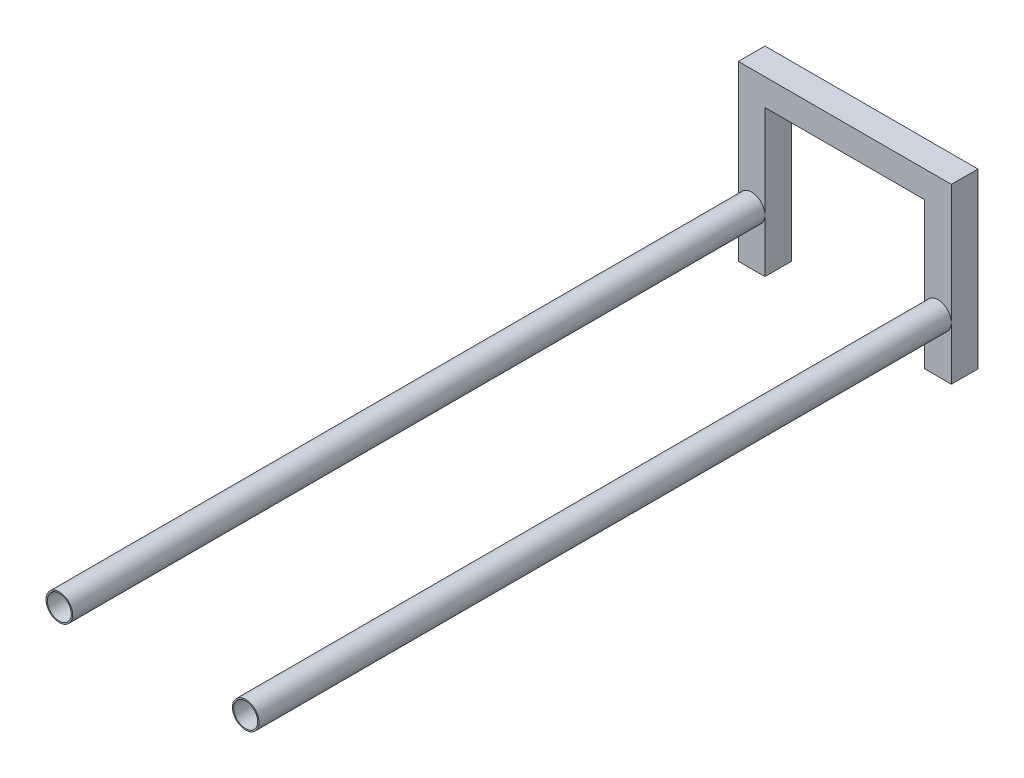
ISO-10303-21;
HEADER;
FILE_DESCRIPTION(('STEP AP214'),'2;1');
FILE_NAME('part.step','',(''),(''),'','','');
FILE_SCHEMA(('AUTOMOTIVE_DESIGN { 1 0 10303 214 1 1 1 1 }'));
ENDSEC;
DATA;
#1=APPLICATION_CONTEXT('core data for automotive mechanical design processes');
#2=APPLICATION_PROTOCOL_DEFINITION('international standard','automotive_design',2000,#1);
#3=PRODUCT_CONTEXT('',#1,'mechanical');
#4=PRODUCT('Part','Part','',(#3));
#5=PRODUCT_RELATED_PRODUCT_CATEGORY('part','',(#4));
#6=PRODUCT_DEFINITION_FORMATION('','',#4);
#7=PRODUCT_DEFINITION_CONTEXT('part definition',#1,'design');
#8=PRODUCT_DEFINITION('design','',#6,#7);
#9=PRODUCT_DEFINITION_SHAPE('','',#8);
#10=(LENGTH_UNIT() NAMED_UNIT(*) SI_UNIT(.MILLI.,.METRE.));
#11=(NAMED_UNIT(*) PLANE_ANGLE_UNIT() SI_UNIT($,.RADIAN.));
#12=(NAMED_UNIT(*) SI_UNIT($,.STERADIAN.) SOLID_ANGLE_UNIT());
#13=UNCERTAINTY_MEASURE_WITH_UNIT(LENGTH_MEASURE(1.E-05),#10,'distance_accuracy_value','');
#14=(GEOMETRIC_REPRESENTATION_CONTEXT(3) GLOBAL_UNCERTAINTY_ASSIGNED_CONTEXT((#13)) GLOBAL_UNIT_ASSIGNED_CONTEXT((#10,
#11,#12)) REPRESENTATION_CONTEXT('',''));
#15=CARTESIAN_POINT('',(0.,0.,0.));
#16=DIRECTION('',(0.,0.,1.));
#17=DIRECTION('',(1.,0.,0.));
#18=AXIS2_PLACEMENT_3D('',#15,#16,#17);
#19=CARTESIAN_POINT('',(101.6,-50.7999999999994,-25.4));
#20=DIRECTION('',(0.,1.,0.));
#21=DIRECTION('',(-1.,0.,0.));
#22=AXIS2_PLACEMENT_3D('',#19,#20,#21);
#23=PLANE('',#22);
#24=DIRECTION('',(-1.,0.,0.));
#25=VECTOR('',#24,1.);
#26=CARTESIAN_POINT('',(101.6,-50.7999999999994,0.));
#27=LINE('',#26,#25);
#28=CARTESIAN_POINT('',(101.6,-50.7999999999994,0.));
#29=VERTEX_POINT('',#28);
#30=CARTESIAN_POINT('',(76.2,-50.7999999999994,0.));
#31=VERTEX_POINT('',#30);
#32=EDGE_CURVE('E264',#29,#31,#27,.T.);
#33=ORIENTED_EDGE('',*,*,#32,.T.);
#34=DIRECTION('',(0.,0.,1.));
#35=VECTOR('',#34,1.);
#36=CARTESIAN_POINT('',(76.2,-50.7999999999994,-25.4));
#37=LINE('',#36,#35);
#38=CARTESIAN_POINT('',(76.2,-50.7999999999994,-25.4));
#39=VERTEX_POINT('',#38);
#40=EDGE_CURVE('E290',#39,#31,#37,.T.);
#41=ORIENTED_EDGE('',*,*,#40,.F.);
#42=DIRECTION('',(-1.,0.,0.));
#43=VECTOR('',#42,1.);
#44=CARTESIAN_POINT('',(101.6,-50.7999999999994,-25.4));
#45=LINE('',#44,#43);
#46=CARTESIAN_POINT('',(101.6,-50.7999999999994,-25.4));
#47=VERTEX_POINT('',#46);
#48=EDGE_CURVE('E243',#47,#39,#45,.T.);
#49=ORIENTED_EDGE('',*,*,#48,.F.);
#50=DIRECTION('',(0.,0.,1.));
#51=VECTOR('',#50,1.);
#52=CARTESIAN_POINT('',(101.6,-50.7999999999994,-25.4));
#53=LINE('',#52,#51);
#54=EDGE_CURVE('E293',#47,#29,#53,.T.);
#55=ORIENTED_EDGE('',*,*,#54,.T.);
#56=EDGE_LOOP('',(#33,#41,#49,#55));
#57=FACE_BOUND('',#56,.T.);
#58=DIRECTION('',(-1.,0.,0.));
#59=VECTOR('',#58,1.);
#60=CARTESIAN_POINT('',(0.,-50.7999999999994,-1.2446));
#61=LINE('',#60,#59);
#62=CARTESIAN_POINT('',(100.3554,-50.7999999999994,-1.2446));
#63=VERTEX_POINT('',#62);
#64=CARTESIAN_POINT('',(77.4446,-50.7999999999994,-1.2446));
#65=VERTEX_POINT('',#64);
#66=EDGE_CURVE('E169',#63,#65,#61,.T.);
#67=ORIENTED_EDGE('',*,*,#66,.F.);
#68=DIRECTION('',(0.,0.,1.));
#69=VECTOR('',#68,1.);
#70=CARTESIAN_POINT('',(100.3554,-50.7999999999994,-25.4));
#71=LINE('',#70,#69);
#72=CARTESIAN_POINT('',(100.3554,-50.7999999999994,-24.1554));
#73=VERTEX_POINT('',#72);
#74=EDGE_CURVE('E203',#73,#63,#71,.T.);
#75=ORIENTED_EDGE('',*,*,#74,.F.);
#76=DIRECTION('',(-1.,0.,0.));
#77=VECTOR('',#76,1.);
#78=CARTESIAN_POINT('',(0.,-50.7999999999994,-24.1554));
#79=LINE('',#78,#77);
#80=CARTESIAN_POINT('',(77.4446,-50.7999999999994,-24.1554));
#81=VERTEX_POINT('',#80);
#82=EDGE_CURVE('E48',#73,#81,#79,.T.);
#83=ORIENTED_EDGE('',*,*,#82,.T.);
#84=DIRECTION('',(0.,0.,1.));
#85=VECTOR('',#84,1.);
#86=CARTESIAN_POINT('',(77.4446,-50.7999999999994,-25.4));
#87=LINE('',#86,#85);
#88=EDGE_CURVE('E179',#81,#65,#87,.T.);
#89=ORIENTED_EDGE('',*,*,#88,.T.);
#90=EDGE_LOOP('',(#67,#75,#83,#89));
#91=FACE_BOUND('',#90,.T.);
#92=ADVANCED_FACE('F33',(#57,#91),#23,.F.);
#93=CARTESIAN_POINT('',(-101.6,-50.7999999999994,-25.4));
#94=DIRECTION('',(0.,1.,0.));
#95=DIRECTION('',(-1.,0.,0.));
#96=AXIS2_PLACEMENT_3D('',#93,#94,#95);
#97=PLANE('',#96);
#98=DIRECTION('',(-1.,0.,0.));
#99=VECTOR('',#98,1.);
#100=CARTESIAN_POINT('',(-101.6,-50.7999999999994,0.));
#101=LINE('',#100,#99);
#102=CARTESIAN_POINT('',(-76.2,-50.7999999999994,0.));
#103=VERTEX_POINT('',#102);
#104=CARTESIAN_POINT('',(-101.6,-50.7999999999994,0.));
#105=VERTEX_POINT('',#104);
#106=EDGE_CURVE('E239',#103,#105,#101,.T.);
#107=ORIENTED_EDGE('',*,*,#106,.T.);
#108=DIRECTION('',(0.,0.,1.));
#109=VECTOR('',#108,1.);
#110=CARTESIAN_POINT('',(-101.6,-50.7999999999994,-25.4));
#111=LINE('',#110,#109);
#112=CARTESIAN_POINT('',(-101.6,-50.7999999999994,-25.4));
#113=VERTEX_POINT('',#112);
#114=EDGE_CURVE('E253',#113,#105,#111,.T.);
#115=ORIENTED_EDGE('',*,*,#114,.F.);
#116=DIRECTION('',(-1.,0.,0.));
#117=VECTOR('',#116,1.);
#118=CARTESIAN_POINT('',(-101.6,-50.7999999999994,-25.4));
#119=LINE('',#118,#117);
#120=CARTESIAN_POINT('',(-76.2,-50.7999999999994,-25.4));
#121=VERTEX_POINT('',#120);
#122=EDGE_CURVE('E251',#121,#113,#119,.T.);
#123=ORIENTED_EDGE('',*,*,#122,.F.);
#124=DIRECTION('',(0.,0.,1.));
#125=VECTOR('',#124,1.);
#126=CARTESIAN_POINT('',(-76.2,-50.7999999999994,-25.4));
#127=LINE('',#126,#125);
#128=EDGE_CURVE('E281',#121,#103,#127,.T.);
#129=ORIENTED_EDGE('',*,*,#128,.T.);
#130=EDGE_LOOP('',(#107,#115,#123,#129));
#131=FACE_BOUND('',#130,.T.);
#132=DIRECTION('',(-1.,0.,0.));
#133=VECTOR('',#132,1.);
#134=CARTESIAN_POINT('',(0.,-50.7999999999994,-1.2446));
#135=LINE('',#134,#133);
#136=CARTESIAN_POINT('',(-77.4446,-50.7999999999994,-1.2446));
#137=VERTEX_POINT('',#136);
#138=CARTESIAN_POINT('',(-100.3554,-50.7999999999994,-1.2446));
#139=VERTEX_POINT('',#138);
#140=EDGE_CURVE('E186',#137,#139,#135,.T.);
#141=ORIENTED_EDGE('',*,*,#140,.F.);
#142=DIRECTION('',(0.,0.,1.));
#143=VECTOR('',#142,1.);
#144=CARTESIAN_POINT('',(-77.4446,-50.7999999999994,-25.4));
#145=LINE('',#144,#143);
#146=CARTESIAN_POINT('',(-77.4446,-50.7999999999994,-24.1554));
#147=VERTEX_POINT('',#146);
#148=EDGE_CURVE('E213',#147,#137,#145,.T.);
#149=ORIENTED_EDGE('',*,*,#148,.F.);
#150=DIRECTION('',(-1.,0.,0.));
#151=VECTOR('',#150,1.);
#152=CARTESIAN_POINT('',(0.,-50.7999999999994,-24.1554));
#153=LINE('',#152,#151);
#154=CARTESIAN_POINT('',(-100.3554,-50.7999999999994,-24.1554));
#155=VERTEX_POINT('',#154);
#156=EDGE_CURVE('E55',#147,#155,#153,.T.);
#157=ORIENTED_EDGE('',*,*,#156,.T.);
#158=DIRECTION('',(0.,0.,1.));
#159=VECTOR('',#158,1.);
#160=CARTESIAN_POINT('',(-100.3554,-50.7999999999994,-25.4));
#161=LINE('',#160,#159);
#162=EDGE_CURVE('E221',#155,#139,#161,.T.);
#163=ORIENTED_EDGE('',*,*,#162,.T.);
#164=EDGE_LOOP('',(#141,#149,#157,#163));
#165=FACE_BOUND('',#164,.T.);
#166=ADVANCED_FACE('F331',(#131,#165),#97,.F.);
#167=CARTESIAN_POINT('',(0.,0.,0.));
#168=DIRECTION('',(0.,0.,1.));
#169=DIRECTION('',(1.,0.,0.));
#170=AXIS2_PLACEMENT_3D('',#167,#168,#169);
#171=PLANE('',#170);
#172=DIRECTION('',(0.,-1.,0.));
#173=VECTOR('',#172,1.);
#174=CARTESIAN_POINT('',(101.6,6.24500451351651E-13,0.));
#175=LINE('',#174,#173);
#176=CARTESIAN_POINT('',(101.6,6.13771459904821E-13,0.));
#177=VERTEX_POINT('',#176);
#178=EDGE_CURVE('E260',#177,#29,#175,.T.);
#179=ORIENTED_EDGE('',*,*,#178,.F.);
#180=CARTESIAN_POINT('',(88.9,6.20710353808728E-13,0.));
#181=DIRECTION('',(0.,0.,1.));
#182=DIRECTION('',(-1.,0.,0.));
#183=AXIS2_PLACEMENT_3D('',#180,#181,#182);
#184=CIRCLE('',#183,12.7);
#185=CARTESIAN_POINT('',(76.2,6.20710353808728E-13,0.));
#186=VERTEX_POINT('',#185);
#187=EDGE_CURVE('E234',#186,#177,#184,.T.);
#188=ORIENTED_EDGE('',*,*,#187,.F.);
#189=DIRECTION('',(0.,1.,0.));
#190=VECTOR('',#189,1.);
#191=CARTESIAN_POINT('',(76.2,88.9,0.));
#192=LINE('',#191,#190);
#193=EDGE_CURVE('E268',#31,#186,#192,.T.);
#194=ORIENTED_EDGE('',*,*,#193,.F.);
#195=ORIENTED_EDGE('',*,*,#32,.F.);
#196=EDGE_LOOP('',(#179,#188,#194,#195));
#197=FACE_BOUND('',#196,.T.);
#198=ADVANCED_FACE('F352',(#197),#171,.T.);
#199=CARTESIAN_POINT('',(76.2,88.9,0.));
#200=VERTEX_POINT('',#199);
#201=EDGE_CURVE('E267',#186,#200,#192,.T.);
#202=ORIENTED_EDGE('',*,*,#201,.F.);
#203=EDGE_CURVE('E229',#177,#186,#184,.T.);
#204=ORIENTED_EDGE('',*,*,#203,.F.);
#205=CARTESIAN_POINT('',(101.6,114.3,0.));
#206=VERTEX_POINT('',#205);
#207=EDGE_CURVE('E261',#206,#177,#175,.T.);
#208=ORIENTED_EDGE('',*,*,#207,.F.);
#209=DIRECTION('',(1.,0.,0.));
#210=VECTOR('',#209,1.);
#211=CARTESIAN_POINT('',(-101.6,114.3,0.));
#212=LINE('',#211,#210);
#213=CARTESIAN_POINT('',(-101.6,114.3,0.));
#214=VERTEX_POINT('',#213);
#215=EDGE_CURVE('E257',#214,#206,#212,.T.);
#216=ORIENTED_EDGE('',*,*,#215,.F.);
#217=DIRECTION('',(0.,1.,0.));
#218=VECTOR('',#217,1.);
#219=CARTESIAN_POINT('',(-101.6,0.,0.));
#220=LINE('',#219,#218);
#221=CARTESIAN_POINT('',(-101.6,0.,0.));
#222=VERTEX_POINT('',#221);
#223=EDGE_CURVE('E233',#222,#214,#220,.T.);
#224=ORIENTED_EDGE('',*,*,#223,.F.);
#225=CARTESIAN_POINT('',(-88.9,0.,0.));
#226=DIRECTION('',(0.,0.,1.));
#227=DIRECTION('',(1.,0.,0.));
#228=AXIS2_PLACEMENT_3D('',#225,#226,#227);
#229=CIRCLE('',#228,12.7);
#230=CARTESIAN_POINT('',(-76.2,0.,0.));
#231=VERTEX_POINT('',#230);
#232=EDGE_CURVE('E310',#231,#222,#229,.T.);
#233=ORIENTED_EDGE('',*,*,#232,.F.);
#234=DIRECTION('',(0.,-1.,0.));
#235=VECTOR('',#234,1.);
#236=CARTESIAN_POINT('',(-76.2,-50.7999999999994,0.));
#237=LINE('',#236,#235);
#238=CARTESIAN_POINT('',(-76.2,88.9,0.));
#239=VERTEX_POINT('',#238);
#240=EDGE_CURVE('E275',#239,#231,#237,.T.);
#241=ORIENTED_EDGE('',*,*,#240,.F.);
#242=DIRECTION('',(-1.,0.,0.));
#243=VECTOR('',#242,1.);
#244=CARTESIAN_POINT('',(-76.2,88.9,0.));
#245=LINE('',#244,#243);
#246=EDGE_CURVE('E271',#200,#239,#245,.T.);
#247=ORIENTED_EDGE('',*,*,#246,.F.);
#248=EDGE_LOOP('',(#202,#204,#208,#216,#224,#233,#241,#247));
#249=FACE_BOUND('',#248,.T.);
#250=ADVANCED_FACE('F323',(#249),#171,.T.);
#251=CARTESIAN_POINT('',(-88.9,0.,660.4));
#252=DIRECTION('',(0.,0.,1.));
#253=DIRECTION('',(1.,0.,0.));
#254=AXIS2_PLACEMENT_3D('',#251,#252,#253);
#255=PLANE('',#254);
#256=CARTESIAN_POINT('',(-88.9,0.,660.4));
#257=DIRECTION('',(0.,0.,1.));
#258=DIRECTION('',(1.,0.,0.));
#259=AXIS2_PLACEMENT_3D('',#256,#257,#258);
#260=CIRCLE('',#259,12.7);
#261=CARTESIAN_POINT('',(-76.2,0.,660.4));
#262=VERTEX_POINT('',#261);
#263=EDGE_CURVE('E41',#262,#262,#260,.T.);
#264=ORIENTED_EDGE('',*,*,#263,.T.);
#265=EDGE_LOOP('',(#264));
#266=FACE_BOUND('',#265,.T.);
#267=CARTESIAN_POINT('',(-88.9,0.,660.4));
#268=DIRECTION('',(0.,0.,1.));
#269=DIRECTION('',(1.,0.,0.));
#270=AXIS2_PLACEMENT_3D('',#267,#268,#269);
#271=CIRCLE('',#270,11.4554);
#272=CARTESIAN_POINT('',(-77.4446,0.,660.4));
#273=VERTEX_POINT('',#272);
#274=EDGE_CURVE('E303',#273,#273,#271,.T.);
#275=ORIENTED_EDGE('',*,*,#274,.F.);
#276=EDGE_LOOP('',(#275));
#277=FACE_BOUND('',#276,.T.);
#278=ADVANCED_FACE('F439',(#266,#277),#255,.T.);
#279=CARTESIAN_POINT('',(-88.9,0.,660.4));
#280=DIRECTION('',(0.,0.,-1.));
#281=DIRECTION('',(-1.,0.,0.));
#282=AXIS2_PLACEMENT_3D('',#279,#280,#281);
#283=CYLINDRICAL_SURFACE('',#282,12.7);
#284=ORIENTED_EDGE('',*,*,#263,.F.);
#285=EDGE_LOOP('',(#284));
#286=FACE_BOUND('',#285,.T.);
#287=ORIENTED_EDGE('',*,*,#232,.T.);
#288=EDGE_CURVE('E306',#222,#231,#229,.T.);
#289=ORIENTED_EDGE('',*,*,#288,.T.);
#290=EDGE_LOOP('',(#287,#289));
#291=FACE_BOUND('',#290,.T.);
#292=ADVANCED_FACE('F35',(#286,#291),#283,.T.);
#293=CARTESIAN_POINT('',(-88.9,0.,660.4));
#294=DIRECTION('',(0.,0.,-1.));
#295=DIRECTION('',(-1.,0.,0.));
#296=AXIS2_PLACEMENT_3D('',#293,#294,#295);
#297=CYLINDRICAL_SURFACE('',#296,11.4554);
#298=ORIENTED_EDGE('',*,*,#274,.T.);
#299=EDGE_LOOP('',(#298));
#300=FACE_BOUND('',#299,.T.);
#301=CARTESIAN_POINT('',(-88.9,0.,0.));
#302=DIRECTION('',(0.,0.,1.));
#303=DIRECTION('',(1.,0.,0.));
#304=AXIS2_PLACEMENT_3D('',#301,#302,#303);
#305=CIRCLE('',#304,11.4554);
#306=CARTESIAN_POINT('',(-77.4446,0.,0.));
#307=VERTEX_POINT('',#306);
#308=EDGE_CURVE('E302',#307,#307,#305,.T.);
#309=ORIENTED_EDGE('',*,*,#308,.F.);
#310=EDGE_LOOP('',(#309));
#311=FACE_BOUND('',#310,.T.);
#312=ADVANCED_FACE('F421',(#300,#311),#297,.F.);
#313=ORIENTED_EDGE('',*,*,#308,.T.);
#314=EDGE_LOOP('',(#313));
#315=FACE_BOUND('',#314,.T.);
#316=ADVANCED_FACE('F418',(#315),#171,.T.);
#317=ORIENTED_EDGE('',*,*,#288,.F.);
#318=EDGE_CURVE('E254',#105,#222,#220,.T.);
#319=ORIENTED_EDGE('',*,*,#318,.F.);
#320=ORIENTED_EDGE('',*,*,#106,.F.);
#321=EDGE_CURVE('E274',#231,#103,#237,.T.);
#322=ORIENTED_EDGE('',*,*,#321,.F.);
#323=EDGE_LOOP('',(#317,#319,#320,#322));
#324=FACE_BOUND('',#323,.T.);
#325=ADVANCED_FACE('F318',(#324),#171,.T.);
#326=CARTESIAN_POINT('',(-101.6,0.,-25.4));
#327=DIRECTION('',(1.,0.,0.));
#328=DIRECTION('',(0.,0.,-1.));
#329=AXIS2_PLACEMENT_3D('',#326,#327,#328);
#330=PLANE('',#329);
#331=ORIENTED_EDGE('',*,*,#318,.T.);
#332=ORIENTED_EDGE('',*,*,#223,.T.);
#333=DIRECTION('',(0.,0.,1.));
#334=VECTOR('',#333,1.);
#335=CARTESIAN_POINT('',(-101.6,114.3,-25.4));
#336=LINE('',#335,#334);
#337=CARTESIAN_POINT('',(-101.6,114.3,-25.4));
#338=VERTEX_POINT('',#337);
#339=EDGE_CURVE('E299',#338,#214,#336,.T.);
#340=ORIENTED_EDGE('',*,*,#339,.F.);
#341=DIRECTION('',(0.,1.,0.));
#342=VECTOR('',#341,1.);
#343=CARTESIAN_POINT('',(-101.6,0.,-25.4));
#344=LINE('',#343,#342);
#345=EDGE_CURVE('E236',#113,#338,#344,.T.);
#346=ORIENTED_EDGE('',*,*,#345,.F.);
#347=ORIENTED_EDGE('',*,*,#114,.T.);
#348=EDGE_LOOP('',(#331,#332,#340,#346,#347));
#349=FACE_BOUND('',#348,.T.);
#350=ADVANCED_FACE('F326',(#349),#330,.F.);
#351=CARTESIAN_POINT('',(-101.6,114.3,-25.4));
#352=DIRECTION('',(0.,-1.,0.));
#353=DIRECTION('',(1.,0.,0.));
#354=AXIS2_PLACEMENT_3D('',#351,#352,#353);
#355=PLANE('',#354);
#356=ORIENTED_EDGE('',*,*,#215,.T.);
#357=DIRECTION('',(0.,0.,1.));
#358=VECTOR('',#357,1.);
#359=CARTESIAN_POINT('',(101.6,114.3,-25.4));
#360=LINE('',#359,#358);
#361=CARTESIAN_POINT('',(101.6,114.3,-25.4));
#362=VERTEX_POINT('',#361);
#363=EDGE_CURVE('E296',#362,#206,#360,.T.);
#364=ORIENTED_EDGE('',*,*,#363,.F.);
#365=DIRECTION('',(1.,0.,0.));
#366=VECTOR('',#365,1.);
#367=CARTESIAN_POINT('',(-101.6,114.3,-25.4));
#368=LINE('',#367,#366);
#369=EDGE_CURVE('E238',#338,#362,#368,.T.);
#370=ORIENTED_EDGE('',*,*,#369,.F.);
#371=ORIENTED_EDGE('',*,*,#339,.T.);
#372=EDGE_LOOP('',(#356,#364,#370,#371));
#373=FACE_BOUND('',#372,.T.);
#374=ADVANCED_FACE('F360',(#373),#355,.F.);
#375=CARTESIAN_POINT('',(101.6,6.24500451351651E-13,-25.4));
#376=DIRECTION('',(-1.,0.,0.));
#377=DIRECTION('',(0.,-1.,0.));
#378=AXIS2_PLACEMENT_3D('',#375,#376,#377);
#379=PLANE('',#378);
#380=ORIENTED_EDGE('',*,*,#207,.T.);
#381=ORIENTED_EDGE('',*,*,#178,.T.);
#382=ORIENTED_EDGE('',*,*,#54,.F.);
#383=DIRECTION('',(0.,-1.,0.));
#384=VECTOR('',#383,1.);
#385=CARTESIAN_POINT('',(101.6,114.3,-25.4));
#386=LINE('',#385,#384);
#387=EDGE_CURVE('E241',#362,#47,#386,.T.);
#388=ORIENTED_EDGE('',*,*,#387,.F.);
#389=ORIENTED_EDGE('',*,*,#363,.T.);
#390=EDGE_LOOP('',(#380,#381,#382,#388,#389));
#391=FACE_BOUND('',#390,.T.);
#392=ADVANCED_FACE('F355',(#391),#379,.F.);
#393=CARTESIAN_POINT('',(76.2,88.9,-25.4));
#394=DIRECTION('',(1.,0.,0.));
#395=DIRECTION('',(0.,0.,-1.));
#396=AXIS2_PLACEMENT_3D('',#393,#394,#395);
#397=PLANE('',#396);
#398=ORIENTED_EDGE('',*,*,#193,.T.);
#399=ORIENTED_EDGE('',*,*,#201,.T.);
#400=DIRECTION('',(0.,0.,1.));
#401=VECTOR('',#400,1.);
#402=CARTESIAN_POINT('',(76.2,88.9,-25.4));
#403=LINE('',#402,#401);
#404=CARTESIAN_POINT('',(76.2,88.9,-25.4));
#405=VERTEX_POINT('',#404);
#406=EDGE_CURVE('E287',#405,#200,#403,.T.);
#407=ORIENTED_EDGE('',*,*,#406,.F.);
#408=DIRECTION('',(0.,1.,0.));
#409=VECTOR('',#408,1.);
#410=CARTESIAN_POINT('',(76.2,-50.7999999999994,-25.4));
#411=LINE('',#410,#409);
#412=EDGE_CURVE('E245',#39,#405,#411,.T.);
#413=ORIENTED_EDGE('',*,*,#412,.F.);
#414=ORIENTED_EDGE('',*,*,#40,.T.);
#415=EDGE_LOOP('',(#398,#399,#407,#413,#414));
#416=FACE_BOUND('',#415,.T.);
#417=ADVANCED_FACE('F345',(#416),#397,.F.);
#418=CARTESIAN_POINT('',(-76.2,88.9,-25.4));
#419=DIRECTION('',(0.,1.,0.));
#420=DIRECTION('',(-1.,0.,0.));
#421=AXIS2_PLACEMENT_3D('',#418,#419,#420);
#422=PLANE('',#421);
#423=ORIENTED_EDGE('',*,*,#246,.T.);
#424=DIRECTION('',(0.,0.,1.));
#425=VECTOR('',#424,1.);
#426=CARTESIAN_POINT('',(-76.2,88.9,-25.4));
#427=LINE('',#426,#425);
#428=CARTESIAN_POINT('',(-76.2,88.9,-25.4));
#429=VERTEX_POINT('',#428);
#430=EDGE_CURVE('E284',#429,#239,#427,.T.);
#431=ORIENTED_EDGE('',*,*,#430,.F.);
#432=DIRECTION('',(-1.,0.,0.));
#433=VECTOR('',#432,1.);
#434=CARTESIAN_POINT('',(-76.2,88.9,-25.4));
#435=LINE('',#434,#433);
#436=EDGE_CURVE('E247',#405,#429,#435,.T.);
#437=ORIENTED_EDGE('',*,*,#436,.F.);
#438=ORIENTED_EDGE('',*,*,#406,.T.);
#439=EDGE_LOOP('',(#423,#431,#437,#438));
#440=FACE_BOUND('',#439,.T.);
#441=ADVANCED_FACE('F340',(#440),#422,.F.);
#442=CARTESIAN_POINT('',(-76.2,-50.7999999999994,-25.4));
#443=DIRECTION('',(-1.,0.,0.));
#444=DIRECTION('',(0.,-1.,0.));
#445=AXIS2_PLACEMENT_3D('',#442,#443,#444);
#446=PLANE('',#445);
#447=ORIENTED_EDGE('',*,*,#240,.T.);
#448=ORIENTED_EDGE('',*,*,#321,.T.);
#449=ORIENTED_EDGE('',*,*,#128,.F.);
#450=DIRECTION('',(0.,-1.,0.));
#451=VECTOR('',#450,1.);
#452=CARTESIAN_POINT('',(-76.2,0.,-25.4));
#453=LINE('',#452,#451);
#454=EDGE_CURVE('E249',#429,#121,#453,.T.);
#455=ORIENTED_EDGE('',*,*,#454,.F.);
#456=ORIENTED_EDGE('',*,*,#430,.T.);
#457=EDGE_LOOP('',(#447,#448,#449,#455,#456));
#458=FACE_BOUND('',#457,.T.);
#459=ADVANCED_FACE('F336',(#458),#446,.F.);
#460=CARTESIAN_POINT('',(0.,0.,-25.4));
#461=DIRECTION('',(0.,0.,1.));
#462=DIRECTION('',(1.,0.,0.));
#463=AXIS2_PLACEMENT_3D('',#460,#461,#462);
#464=PLANE('',#463);
#465=ORIENTED_EDGE('',*,*,#345,.T.);
#466=ORIENTED_EDGE('',*,*,#369,.T.);
#467=ORIENTED_EDGE('',*,*,#387,.T.);
#468=ORIENTED_EDGE('',*,*,#48,.T.);
#469=ORIENTED_EDGE('',*,*,#412,.T.);
#470=ORIENTED_EDGE('',*,*,#436,.T.);
#471=ORIENTED_EDGE('',*,*,#454,.T.);
#472=ORIENTED_EDGE('',*,*,#122,.T.);
#473=EDGE_LOOP('',(#465,#466,#467,#468,#469,#470,#471,#472));
#474=FACE_BOUND('',#473,.T.);
#475=ADVANCED_FACE('F362',(#474),#464,.F.);
#476=CARTESIAN_POINT('',(88.9,6.20710353808728E-13,660.4));
#477=DIRECTION('',(0.,0.,-1.));
#478=DIRECTION('',(-1.,0.,0.));
#479=AXIS2_PLACEMENT_3D('',#476,#477,#478);
#480=PLANE('',#479);
#481=CARTESIAN_POINT('',(88.9,6.20710353808728E-13,660.4));
#482=DIRECTION('',(0.,0.,1.));
#483=DIRECTION('',(-1.,0.,0.));
#484=AXIS2_PLACEMENT_3D('',#481,#482,#483);
#485=CIRCLE('',#484,12.7);
#486=CARTESIAN_POINT('',(76.2,6.20710353808728E-13,660.4));
#487=VERTEX_POINT('',#486);
#488=EDGE_CURVE('E230',#487,#487,#485,.T.);
#489=ORIENTED_EDGE('',*,*,#488,.T.);
#490=EDGE_LOOP('',(#489));
#491=FACE_BOUND('',#490,.T.);
#492=CARTESIAN_POINT('',(88.9,6.20710353808728E-13,660.4));
#493=DIRECTION('',(0.,0.,1.));
#494=DIRECTION('',(-1.,0.,0.));
#495=AXIS2_PLACEMENT_3D('',#492,#493,#494);
#496=CIRCLE('',#495,11.4554);
#497=CARTESIAN_POINT('',(77.4446,6.20710353808728E-13,660.4));
#498=VERTEX_POINT('',#497);
#499=EDGE_CURVE('E196',#498,#498,#496,.T.);
#500=ORIENTED_EDGE('',*,*,#499,.F.);
#501=EDGE_LOOP('',(#500));
#502=FACE_BOUND('',#501,.T.);
#503=ADVANCED_FACE('F409',(#491,#502),#480,.F.);
#504=CARTESIAN_POINT('',(88.9,6.20710353808728E-13,660.4));
#505=DIRECTION('',(0.,0.,-1.));
#506=DIRECTION('',(-1.,0.,0.));
#507=AXIS2_PLACEMENT_3D('',#504,#505,#506);
#508=CYLINDRICAL_SURFACE('',#507,12.7);
#509=ORIENTED_EDGE('',*,*,#488,.F.);
#510=EDGE_LOOP('',(#509));
#511=FACE_BOUND('',#510,.T.);
#512=ORIENTED_EDGE('',*,*,#187,.T.);
#513=ORIENTED_EDGE('',*,*,#203,.T.);
#514=EDGE_LOOP('',(#512,#513));
#515=FACE_BOUND('',#514,.T.);
#516=ADVANCED_FACE('F407',(#511,#515),#508,.T.);
#517=CARTESIAN_POINT('',(88.9,6.20710353808728E-13,660.4));
#518=DIRECTION('',(0.,0.,-1.));
#519=DIRECTION('',(-1.,0.,0.));
#520=AXIS2_PLACEMENT_3D('',#517,#518,#519);
#521=CYLINDRICAL_SURFACE('',#520,11.4554);
#522=ORIENTED_EDGE('',*,*,#499,.T.);
#523=EDGE_LOOP('',(#522));
#524=FACE_BOUND('',#523,.T.);
#525=CARTESIAN_POINT('',(88.9,6.20710353808728E-13,0.));
#526=DIRECTION('',(0.,0.,1.));
#527=DIRECTION('',(1.,0.,0.));
#528=AXIS2_PLACEMENT_3D('',#525,#526,#527);
#529=CIRCLE('',#528,11.4554);
#530=CARTESIAN_POINT('',(100.3554,6.20710353808728E-13,0.));
#531=VERTEX_POINT('',#530);
#532=EDGE_CURVE('E11',#531,#531,#529,.F.);
#533=ORIENTED_EDGE('',*,*,#532,.T.);
#534=EDGE_LOOP('',(#533));
#535=FACE_BOUND('',#534,.T.);
#536=ADVANCED_FACE('F403',(#524,#535),#521,.F.);
#537=ORIENTED_EDGE('',*,*,#532,.F.);
#538=EDGE_LOOP('',(#537));
#539=FACE_BOUND('',#538,.T.);
#540=ADVANCED_FACE('F406',(#539),#171,.T.);
#541=CARTESIAN_POINT('',(0.,0.,-1.2446));
#542=DIRECTION('',(0.,0.,1.));
#543=DIRECTION('',(1.,0.,0.));
#544=AXIS2_PLACEMENT_3D('',#541,#542,#543);
#545=PLANE('',#544);
#546=ORIENTED_EDGE('',*,*,#140,.T.);
#547=DIRECTION('',(0.,1.,0.));
#548=VECTOR('',#547,1.);
#549=CARTESIAN_POINT('',(-100.3554,0.,-1.2446));
#550=LINE('',#549,#548);
#551=CARTESIAN_POINT('',(-100.3554,113.0554,-1.2446));
#552=VERTEX_POINT('',#551);
#553=EDGE_CURVE('E190',#139,#552,#550,.T.);
#554=ORIENTED_EDGE('',*,*,#553,.T.);
#555=DIRECTION('',(1.,0.,0.));
#556=VECTOR('',#555,1.);
#557=CARTESIAN_POINT('',(0.,113.0554,-1.2446));
#558=LINE('',#557,#556);
#559=CARTESIAN_POINT('',(100.3554,113.0554,-1.2446));
#560=VERTEX_POINT('',#559);
#561=EDGE_CURVE('E192',#552,#560,#558,.T.);
#562=ORIENTED_EDGE('',*,*,#561,.T.);
#563=DIRECTION('',(0.,-1.,0.));
#564=VECTOR('',#563,1.);
#565=CARTESIAN_POINT('',(100.3554,0.,-1.2446));
#566=LINE('',#565,#564);
#567=EDGE_CURVE('E215',#560,#63,#566,.T.);
#568=ORIENTED_EDGE('',*,*,#567,.T.);
#569=ORIENTED_EDGE('',*,*,#66,.T.);
#570=DIRECTION('',(0.,1.,0.));
#571=VECTOR('',#570,1.);
#572=CARTESIAN_POINT('',(77.4446,0.,-1.2446));
#573=LINE('',#572,#571);
#574=CARTESIAN_POINT('',(77.4446,90.1446,-1.2446));
#575=VERTEX_POINT('',#574);
#576=EDGE_CURVE('E161',#65,#575,#573,.T.);
#577=ORIENTED_EDGE('',*,*,#576,.T.);
#578=DIRECTION('',(-1.,0.,0.));
#579=VECTOR('',#578,1.);
#580=CARTESIAN_POINT('',(0.,90.1446,-1.2446));
#581=LINE('',#580,#579);
#582=CARTESIAN_POINT('',(-77.4445999999999,90.1446,-1.2446));
#583=VERTEX_POINT('',#582);
#584=EDGE_CURVE('E166',#575,#583,#581,.T.);
#585=ORIENTED_EDGE('',*,*,#584,.T.);
#586=DIRECTION('',(0.,-1.,0.));
#587=VECTOR('',#586,1.);
#588=CARTESIAN_POINT('',(-77.4446,0.,-1.2446));
#589=LINE('',#588,#587);
#590=EDGE_CURVE('E184',#583,#137,#589,.T.);
#591=ORIENTED_EDGE('',*,*,#590,.T.);
#592=EDGE_LOOP('',(#546,#554,#562,#568,#569,#577,#585,#591));
#593=FACE_BOUND('',#592,.T.);
#594=ADVANCED_FACE('F164',(#593),#545,.F.);
#595=CARTESIAN_POINT('',(-100.3554,0.,-25.4));
#596=DIRECTION('',(1.,0.,0.));
#597=DIRECTION('',(0.,0.,-1.));
#598=AXIS2_PLACEMENT_3D('',#595,#596,#597);
#599=PLANE('',#598);
#600=ORIENTED_EDGE('',*,*,#553,.F.);
#601=ORIENTED_EDGE('',*,*,#162,.F.);
#602=DIRECTION('',(0.,1.,0.));
#603=VECTOR('',#602,1.);
#604=CARTESIAN_POINT('',(-100.3554,0.,-24.1554));
#605=LINE('',#604,#603);
#606=CARTESIAN_POINT('',(-100.3554,113.0554,-24.1554));
#607=VERTEX_POINT('',#606);
#608=EDGE_CURVE('E198',#155,#607,#605,.T.);
#609=ORIENTED_EDGE('',*,*,#608,.T.);
#610=DIRECTION('',(0.,0.,1.));
#611=VECTOR('',#610,1.);
#612=CARTESIAN_POINT('',(-100.3554,113.0554,-25.4));
#613=LINE('',#612,#611);
#614=EDGE_CURVE('E193',#607,#552,#613,.T.);
#615=ORIENTED_EDGE('',*,*,#614,.T.);
#616=EDGE_LOOP('',(#600,#601,#609,#615));
#617=FACE_BOUND('',#616,.T.);
#618=ADVANCED_FACE('F377',(#617),#599,.T.);
#619=CARTESIAN_POINT('',(-101.6,113.0554,-25.4));
#620=DIRECTION('',(0.,-1.,0.));
#621=DIRECTION('',(1.,0.,0.));
#622=AXIS2_PLACEMENT_3D('',#619,#620,#621);
#623=PLANE('',#622);
#624=ORIENTED_EDGE('',*,*,#561,.F.);
#625=ORIENTED_EDGE('',*,*,#614,.F.);
#626=DIRECTION('',(1.,0.,0.));
#627=VECTOR('',#626,1.);
#628=CARTESIAN_POINT('',(0.,113.0554,-24.1554));
#629=LINE('',#628,#627);
#630=CARTESIAN_POINT('',(100.3554,113.0554,-24.1554));
#631=VERTEX_POINT('',#630);
#632=EDGE_CURVE('E200',#607,#631,#629,.T.);
#633=ORIENTED_EDGE('',*,*,#632,.T.);
#634=DIRECTION('',(0.,0.,1.));
#635=VECTOR('',#634,1.);
#636=CARTESIAN_POINT('',(100.3554,113.0554,-25.4));
#637=LINE('',#636,#635);
#638=EDGE_CURVE('E197',#631,#560,#637,.T.);
#639=ORIENTED_EDGE('',*,*,#638,.T.);
#640=EDGE_LOOP('',(#624,#625,#633,#639));
#641=FACE_BOUND('',#640,.T.);
#642=ADVANCED_FACE('F383',(#641),#623,.T.);
#643=CARTESIAN_POINT('',(100.3554,6.25180462954233E-13,-25.4));
#644=DIRECTION('',(-1.,0.,0.));
#645=DIRECTION('',(0.,-1.,0.));
#646=AXIS2_PLACEMENT_3D('',#643,#644,#645);
#647=PLANE('',#646);
#648=ORIENTED_EDGE('',*,*,#567,.F.);
#649=ORIENTED_EDGE('',*,*,#638,.F.);
#650=DIRECTION('',(0.,-1.,0.));
#651=VECTOR('',#650,1.);
#652=CARTESIAN_POINT('',(100.3554,0.,-24.1554));
#653=LINE('',#652,#651);
#654=EDGE_CURVE('E205',#631,#73,#653,.T.);
#655=ORIENTED_EDGE('',*,*,#654,.T.);
#656=ORIENTED_EDGE('',*,*,#74,.T.);
#657=EDGE_LOOP('',(#648,#649,#655,#656));
#658=FACE_BOUND('',#657,.T.);
#659=ADVANCED_FACE('F385',(#658),#647,.T.);
#660=CARTESIAN_POINT('',(77.4446,88.9,-25.4));
#661=DIRECTION('',(1.,0.,0.));
#662=DIRECTION('',(0.,0.,-1.));
#663=AXIS2_PLACEMENT_3D('',#660,#661,#662);
#664=PLANE('',#663);
#665=ORIENTED_EDGE('',*,*,#576,.F.);
#666=ORIENTED_EDGE('',*,*,#88,.F.);
#667=DIRECTION('',(0.,1.,0.));
#668=VECTOR('',#667,1.);
#669=CARTESIAN_POINT('',(77.4446,0.,-24.1554));
#670=LINE('',#669,#668);
#671=CARTESIAN_POINT('',(77.4446,90.1446,-24.1554));
#672=VERTEX_POINT('',#671);
#673=EDGE_CURVE('E176',#81,#672,#670,.T.);
#674=ORIENTED_EDGE('',*,*,#673,.T.);
#675=DIRECTION('',(0.,0.,1.));
#676=VECTOR('',#675,1.);
#677=CARTESIAN_POINT('',(77.4446,90.1446,-25.4));
#678=LINE('',#677,#676);
#679=EDGE_CURVE('E174',#672,#575,#678,.T.);
#680=ORIENTED_EDGE('',*,*,#679,.T.);
#681=EDGE_LOOP('',(#665,#666,#674,#680));
#682=FACE_BOUND('',#681,.T.);
#683=ADVANCED_FACE('F175',(#682),#664,.T.);
#684=CARTESIAN_POINT('',(-76.2,90.1446,-25.4));
#685=DIRECTION('',(0.,1.,0.));
#686=DIRECTION('',(-1.,0.,0.));
#687=AXIS2_PLACEMENT_3D('',#684,#685,#686);
#688=PLANE('',#687);
#689=ORIENTED_EDGE('',*,*,#584,.F.);
#690=ORIENTED_EDGE('',*,*,#679,.F.);
#691=DIRECTION('',(-1.,0.,0.));
#692=VECTOR('',#691,1.);
#693=CARTESIAN_POINT('',(0.,90.1446,-24.1554));
#694=LINE('',#693,#692);
#695=CARTESIAN_POINT('',(-77.4445999999999,90.1446,-24.1554));
#696=VERTEX_POINT('',#695);
#697=EDGE_CURVE('E208',#672,#696,#694,.T.);
#698=ORIENTED_EDGE('',*,*,#697,.T.);
#699=DIRECTION('',(0.,0.,1.));
#700=VECTOR('',#699,1.);
#701=CARTESIAN_POINT('',(-77.4445999999999,90.1446,-25.4));
#702=LINE('',#701,#700);
#703=EDGE_CURVE('E180',#696,#583,#702,.T.);
#704=ORIENTED_EDGE('',*,*,#703,.T.);
#705=EDGE_LOOP('',(#689,#690,#698,#704));
#706=FACE_BOUND('',#705,.T.);
#707=ADVANCED_FACE('F182',(#706),#688,.T.);
#708=CARTESIAN_POINT('',(-77.4446,-50.7999999999994,-25.4));
#709=DIRECTION('',(-1.,0.,0.));
#710=DIRECTION('',(0.,-1.,0.));
#711=AXIS2_PLACEMENT_3D('',#708,#709,#710);
#712=PLANE('',#711);
#713=ORIENTED_EDGE('',*,*,#590,.F.);
#714=ORIENTED_EDGE('',*,*,#703,.F.);
#715=DIRECTION('',(0.,-1.,0.));
#716=VECTOR('',#715,1.);
#717=CARTESIAN_POINT('',(-77.4446,0.,-24.1554));
#718=LINE('',#717,#716);
#719=EDGE_CURVE('E210',#696,#147,#718,.T.);
#720=ORIENTED_EDGE('',*,*,#719,.T.);
#721=ORIENTED_EDGE('',*,*,#148,.T.);
#722=EDGE_LOOP('',(#713,#714,#720,#721));
#723=FACE_BOUND('',#722,.T.);
#724=ADVANCED_FACE('F372',(#723),#712,.T.);
#725=CARTESIAN_POINT('',(0.,0.,-24.1554));
#726=DIRECTION('',(0.,0.,1.));
#727=DIRECTION('',(1.,0.,0.));
#728=AXIS2_PLACEMENT_3D('',#725,#726,#727);
#729=PLANE('',#728);
#730=ORIENTED_EDGE('',*,*,#608,.F.);
#731=ORIENTED_EDGE('',*,*,#156,.F.);
#732=ORIENTED_EDGE('',*,*,#719,.F.);
#733=ORIENTED_EDGE('',*,*,#697,.F.);
#734=ORIENTED_EDGE('',*,*,#673,.F.);
#735=ORIENTED_EDGE('',*,*,#82,.F.);
#736=ORIENTED_EDGE('',*,*,#654,.F.);
#737=ORIENTED_EDGE('',*,*,#632,.F.);
#738=EDGE_LOOP('',(#730,#731,#732,#733,#734,#735,#736,#737));
#739=FACE_BOUND('',#738,.T.);
#740=ADVANCED_FACE('F370',(#739),#729,.T.);
#741=CLOSED_SHELL('',(#92,#166,#198,#250,#278,#292,#312,#316,#325,#350,#374,#392,#417,#441,#459,
#475,#503,#516,#536,#540,#594,#618,#642,#659,#683,#707,#724,#740));
#742=MANIFOLD_SOLID_BREP('B2',#741);
#743=ADVANCED_BREP_SHAPE_REPRESENTATION('',(#18,#742),#14);
#744=SHAPE_DEFINITION_REPRESENTATION(#9,#743);
ENDSEC;
END-ISO-10303-21;
